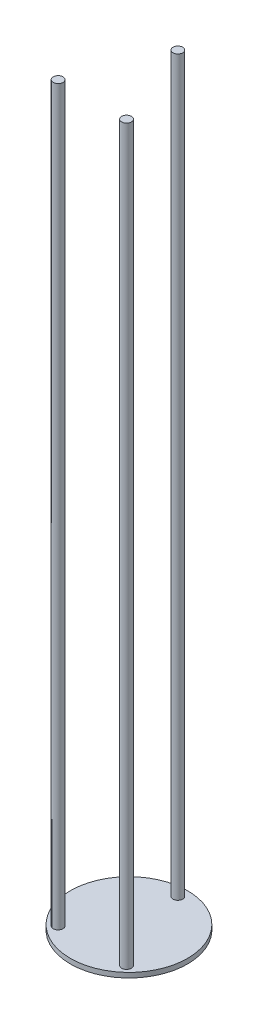
ISO-10303-21;
HEADER;
FILE_DESCRIPTION(('STEP AP214'),'2;1');
FILE_NAME('part.step','',(''),(''),'','','');
FILE_SCHEMA(('AUTOMOTIVE_DESIGN { 1 0 10303 214 1 1 1 1 }'));
ENDSEC;
DATA;
#1=APPLICATION_CONTEXT('core data for automotive mechanical design processes');
#2=APPLICATION_PROTOCOL_DEFINITION('international standard','automotive_design',2000,#1);
#3=PRODUCT_CONTEXT('',#1,'mechanical');
#4=PRODUCT('Part','Part','',(#3));
#5=PRODUCT_RELATED_PRODUCT_CATEGORY('part','',(#4));
#6=PRODUCT_DEFINITION_FORMATION('','',#4);
#7=PRODUCT_DEFINITION_CONTEXT('part definition',#1,'design');
#8=PRODUCT_DEFINITION('design','',#6,#7);
#9=PRODUCT_DEFINITION_SHAPE('','',#8);
#10=(LENGTH_UNIT() NAMED_UNIT(*) SI_UNIT(.MILLI.,.METRE.));
#11=(NAMED_UNIT(*) PLANE_ANGLE_UNIT() SI_UNIT($,.RADIAN.));
#12=(NAMED_UNIT(*) SI_UNIT($,.STERADIAN.) SOLID_ANGLE_UNIT());
#13=UNCERTAINTY_MEASURE_WITH_UNIT(LENGTH_MEASURE(1.E-05),#10,'distance_accuracy_value','');
#14=(GEOMETRIC_REPRESENTATION_CONTEXT(3) GLOBAL_UNCERTAINTY_ASSIGNED_CONTEXT((#13)) GLOBAL_UNIT_ASSIGNED_CONTEXT((#10,
#11,#12)) REPRESENTATION_CONTEXT('',''));
#15=CARTESIAN_POINT('',(0.,0.,0.));
#16=DIRECTION('',(0.,0.,1.));
#17=DIRECTION('',(1.,0.,0.));
#18=AXIS2_PLACEMENT_3D('',#15,#16,#17);
#19=CARTESIAN_POINT('',(0.,10.,0.));
#20=DIRECTION('',(0.,-1.,0.));
#21=DIRECTION('',(0.,0.,-1.));
#22=AXIS2_PLACEMENT_3D('',#19,#20,#21);
#23=CYLINDRICAL_SURFACE('',#22,120.);
#24=CARTESIAN_POINT('',(0.,10.,0.));
#25=DIRECTION('',(0.,1.,0.));
#26=DIRECTION('',(0.,0.,1.));
#27=AXIS2_PLACEMENT_3D('',#24,#25,#26);
#28=CIRCLE('',#27,120.);
#29=CARTESIAN_POINT('',(0.,10.,120.));
#30=VERTEX_POINT('',#29);
#31=EDGE_CURVE('E10',#30,#30,#28,.T.);
#32=ORIENTED_EDGE('',*,*,#31,.F.);
#33=EDGE_LOOP('',(#32));
#34=FACE_BOUND('',#33,.T.);
#35=CARTESIAN_POINT('',(0.,0.,0.));
#36=DIRECTION('',(0.,1.,0.));
#37=DIRECTION('',(0.,0.,1.));
#38=AXIS2_PLACEMENT_3D('',#35,#36,#37);
#39=CIRCLE('',#38,120.);
#40=CARTESIAN_POINT('',(0.,0.,120.));
#41=VERTEX_POINT('',#40);
#42=EDGE_CURVE('E42',#41,#41,#39,.T.);
#43=ORIENTED_EDGE('',*,*,#42,.T.);
#44=EDGE_LOOP('',(#43));
#45=FACE_BOUND('',#44,.T.);
#46=ADVANCED_FACE('F39',(#34,#45),#23,.T.);
#47=CARTESIAN_POINT('',(0.,10.,0.));
#48=DIRECTION('',(0.,1.,0.));
#49=DIRECTION('',(0.,0.,1.));
#50=AXIS2_PLACEMENT_3D('',#47,#48,#49);
#51=PLANE('',#50);
#52=CARTESIAN_POINT('',(70.,10.,75.));
#53=DIRECTION('',(0.,1.,0.));
#54=DIRECTION('',(0.,0.,-1.));
#55=AXIS2_PLACEMENT_3D('',#52,#53,#54);
#56=CIRCLE('',#55,10.);
#57=CARTESIAN_POINT('',(70.,10.,65.));
#58=VERTEX_POINT('',#57);
#59=EDGE_CURVE('E63',#58,#58,#56,.T.);
#60=ORIENTED_EDGE('',*,*,#59,.F.);
#61=EDGE_LOOP('',(#60));
#62=FACE_BOUND('',#61,.T.);
#63=CARTESIAN_POINT('',(-70.,10.,75.));
#64=DIRECTION('',(0.,1.,0.));
#65=DIRECTION('',(0.,0.,1.));
#66=AXIS2_PLACEMENT_3D('',#63,#64,#65);
#67=CIRCLE('',#66,10.);
#68=CARTESIAN_POINT('',(-70.,10.,85.));
#69=VERTEX_POINT('',#68);
#70=EDGE_CURVE('E57',#69,#69,#67,.T.);
#71=ORIENTED_EDGE('',*,*,#70,.F.);
#72=EDGE_LOOP('',(#71));
#73=FACE_BOUND('',#72,.T.);
#74=CARTESIAN_POINT('',(0.,10.,-100.));
#75=DIRECTION('',(0.,1.,0.));
#76=DIRECTION('',(0.,0.,1.));
#77=AXIS2_PLACEMENT_3D('',#74,#75,#76);
#78=CIRCLE('',#77,10.);
#79=CARTESIAN_POINT('',(0.,10.,-90.));
#80=VERTEX_POINT('',#79);
#81=EDGE_CURVE('E51',#80,#80,#78,.T.);
#82=ORIENTED_EDGE('',*,*,#81,.F.);
#83=EDGE_LOOP('',(#82));
#84=FACE_BOUND('',#83,.T.);
#85=ORIENTED_EDGE('',*,*,#31,.T.);
#86=EDGE_LOOP('',(#85));
#87=FACE_BOUND('',#86,.T.);
#88=ADVANCED_FACE('F78',(#62,#73,#84,#87),#51,.T.);
#89=CARTESIAN_POINT('',(0.,0.,0.));
#90=DIRECTION('',(0.,1.,0.));
#91=DIRECTION('',(0.,0.,1.));
#92=AXIS2_PLACEMENT_3D('',#89,#90,#91);
#93=PLANE('',#92);
#94=ORIENTED_EDGE('',*,*,#42,.F.);
#95=EDGE_LOOP('',(#94));
#96=FACE_BOUND('',#95,.T.);
#97=ADVANCED_FACE('F81',(#96),#93,.F.);
#98=CARTESIAN_POINT('',(0.,1510.,-100.));
#99=DIRECTION('',(0.,-1.,0.));
#100=DIRECTION('',(0.,0.,-1.));
#101=AXIS2_PLACEMENT_3D('',#98,#99,#100);
#102=CYLINDRICAL_SURFACE('',#101,10.);
#103=CARTESIAN_POINT('',(0.,1510.,-100.));
#104=DIRECTION('',(0.,1.,0.));
#105=DIRECTION('',(0.,0.,1.));
#106=AXIS2_PLACEMENT_3D('',#103,#104,#105);
#107=CIRCLE('',#106,10.);
#108=CARTESIAN_POINT('',(0.,1510.,-90.));
#109=VERTEX_POINT('',#108);
#110=EDGE_CURVE('E49',#109,#109,#107,.T.);
#111=ORIENTED_EDGE('',*,*,#110,.F.);
#112=EDGE_LOOP('',(#111));
#113=FACE_BOUND('',#112,.T.);
#114=ORIENTED_EDGE('',*,*,#81,.T.);
#115=EDGE_LOOP('',(#114));
#116=FACE_BOUND('',#115,.T.);
#117=ADVANCED_FACE('F87',(#113,#116),#102,.T.);
#118=CARTESIAN_POINT('',(0.,1510.,-100.));
#119=DIRECTION('',(0.,1.,0.));
#120=DIRECTION('',(0.,0.,1.));
#121=AXIS2_PLACEMENT_3D('',#118,#119,#120);
#122=PLANE('',#121);
#123=ORIENTED_EDGE('',*,*,#110,.T.);
#124=EDGE_LOOP('',(#123));
#125=FACE_BOUND('',#124,.T.);
#126=ADVANCED_FACE('F89',(#125),#122,.T.);
#127=CARTESIAN_POINT('',(-70.,1510.,75.));
#128=DIRECTION('',(0.,-1.,0.));
#129=DIRECTION('',(0.,0.,-1.));
#130=AXIS2_PLACEMENT_3D('',#127,#128,#129);
#131=CYLINDRICAL_SURFACE('',#130,10.);
#132=CARTESIAN_POINT('',(-70.,1510.,75.));
#133=DIRECTION('',(0.,1.,0.));
#134=DIRECTION('',(0.,0.,1.));
#135=AXIS2_PLACEMENT_3D('',#132,#133,#134);
#136=CIRCLE('',#135,10.);
#137=CARTESIAN_POINT('',(-70.,1510.,85.));
#138=VERTEX_POINT('',#137);
#139=EDGE_CURVE('E54',#138,#138,#136,.T.);
#140=ORIENTED_EDGE('',*,*,#139,.F.);
#141=EDGE_LOOP('',(#140));
#142=FACE_BOUND('',#141,.T.);
#143=ORIENTED_EDGE('',*,*,#70,.T.);
#144=EDGE_LOOP('',(#143));
#145=FACE_BOUND('',#144,.T.);
#146=ADVANCED_FACE('F96',(#142,#145),#131,.T.);
#147=CARTESIAN_POINT('',(-70.,1510.,75.));
#148=DIRECTION('',(0.,1.,0.));
#149=DIRECTION('',(0.,0.,1.));
#150=AXIS2_PLACEMENT_3D('',#147,#148,#149);
#151=PLANE('',#150);
#152=ORIENTED_EDGE('',*,*,#139,.T.);
#153=EDGE_LOOP('',(#152));
#154=FACE_BOUND('',#153,.T.);
#155=ADVANCED_FACE('F74',(#154),#151,.T.);
#156=CARTESIAN_POINT('',(70.,1510.,75.));
#157=DIRECTION('',(0.,-1.,0.));
#158=DIRECTION('',(0.,0.,-1.));
#159=AXIS2_PLACEMENT_3D('',#156,#157,#158);
#160=CYLINDRICAL_SURFACE('',#159,10.);
#161=CARTESIAN_POINT('',(70.,1510.,75.));
#162=DIRECTION('',(0.,1.,0.));
#163=DIRECTION('',(0.,0.,-1.));
#164=AXIS2_PLACEMENT_3D('',#161,#162,#163);
#165=CIRCLE('',#164,10.);
#166=CARTESIAN_POINT('',(70.,1510.,65.));
#167=VERTEX_POINT('',#166);
#168=EDGE_CURVE('E60',#167,#167,#165,.T.);
#169=ORIENTED_EDGE('',*,*,#168,.F.);
#170=EDGE_LOOP('',(#169));
#171=FACE_BOUND('',#170,.T.);
#172=ORIENTED_EDGE('',*,*,#59,.T.);
#173=EDGE_LOOP('',(#172));
#174=FACE_BOUND('',#173,.T.);
#175=ADVANCED_FACE('F71',(#171,#174),#160,.T.);
#176=CARTESIAN_POINT('',(70.,1510.,75.));
#177=DIRECTION('',(0.,-1.,0.));
#178=DIRECTION('',(0.,0.,-1.));
#179=AXIS2_PLACEMENT_3D('',#176,#177,#178);
#180=PLANE('',#179);
#181=ORIENTED_EDGE('',*,*,#168,.T.);
#182=EDGE_LOOP('',(#181));
#183=FACE_BOUND('',#182,.T.);
#184=ADVANCED_FACE('F69',(#183),#180,.F.);
#185=CLOSED_SHELL('',(#46,#88,#97,#117,#126,#146,#155,#175,#184));
#186=MANIFOLD_SOLID_BREP('B2',#185);
#187=ADVANCED_BREP_SHAPE_REPRESENTATION('',(#18,#186),#14);
#188=SHAPE_DEFINITION_REPRESENTATION(#9,#187);
ENDSEC;
END-ISO-10303-21;
